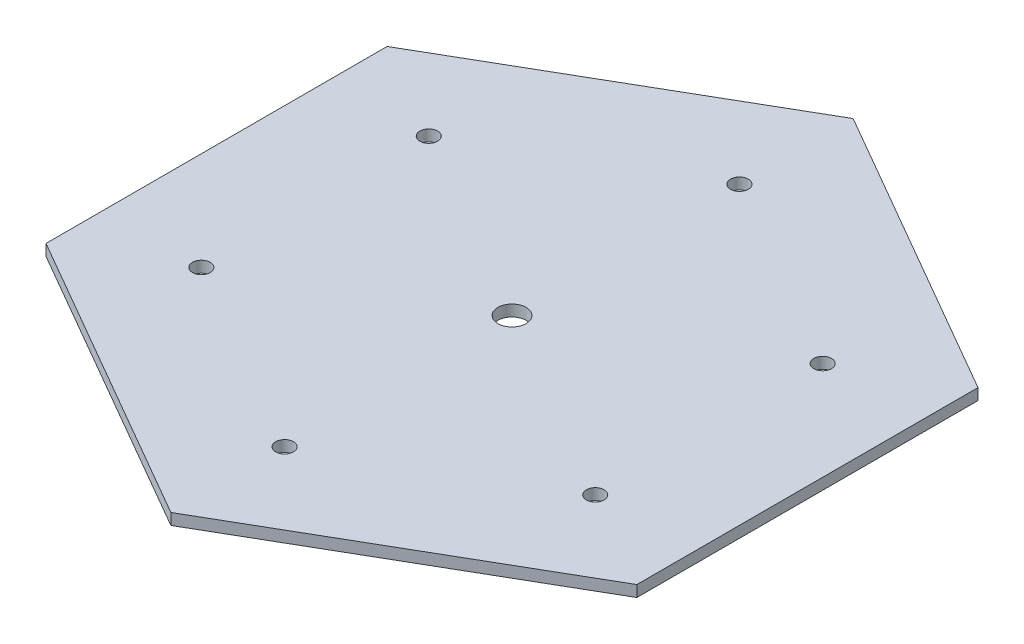
ISO-10303-21;
HEADER;
FILE_DESCRIPTION(('STEP AP214'),'2;1');
FILE_NAME('part.step','',(''),(''),'','','');
FILE_SCHEMA(('AUTOMOTIVE_DESIGN { 1 0 10303 214 1 1 1 1 }'));
ENDSEC;
DATA;
#1=APPLICATION_CONTEXT('core data for automotive mechanical design processes');
#2=APPLICATION_PROTOCOL_DEFINITION('international standard','automotive_design',2000,#1);
#3=PRODUCT_CONTEXT('',#1,'mechanical');
#4=PRODUCT('Part','Part','',(#3));
#5=PRODUCT_RELATED_PRODUCT_CATEGORY('part','',(#4));
#6=PRODUCT_DEFINITION_FORMATION('','',#4);
#7=PRODUCT_DEFINITION_CONTEXT('part definition',#1,'design');
#8=PRODUCT_DEFINITION('design','',#6,#7);
#9=PRODUCT_DEFINITION_SHAPE('','',#8);
#10=(LENGTH_UNIT() NAMED_UNIT(*) SI_UNIT(.MILLI.,.METRE.));
#11=(NAMED_UNIT(*) PLANE_ANGLE_UNIT() SI_UNIT($,.RADIAN.));
#12=(NAMED_UNIT(*) SI_UNIT($,.STERADIAN.) SOLID_ANGLE_UNIT());
#13=UNCERTAINTY_MEASURE_WITH_UNIT(LENGTH_MEASURE(1.E-05),#10,'distance_accuracy_value','');
#14=(GEOMETRIC_REPRESENTATION_CONTEXT(3) GLOBAL_UNCERTAINTY_ASSIGNED_CONTEXT((#13)) GLOBAL_UNIT_ASSIGNED_CONTEXT((#10,
#11,#12)) REPRESENTATION_CONTEXT('',''));
#15=CARTESIAN_POINT('',(0.,0.,0.));
#16=DIRECTION('',(0.,0.,1.));
#17=DIRECTION('',(1.,0.,0.));
#18=AXIS2_PLACEMENT_3D('',#15,#16,#17);
#19=CARTESIAN_POINT('',(41.656,3.175,-72.1503084400892));
#20=DIRECTION('',(-0.5,0.,0.866025403784439));
#21=DIRECTION('',(0.866025403784439,0.,0.5));
#22=AXIS2_PLACEMENT_3D('',#19,#20,#21);
#23=PLANE('',#22);
#24=DIRECTION('',(-0.866025403784439,0.,-0.5));
#25=VECTOR('',#24,1.);
#26=CARTESIAN_POINT('',(41.656,0.,-72.1503084400892));
#27=LINE('',#26,#25);
#28=CARTESIAN_POINT('',(83.312,0.,-48.1002056267261));
#29=VERTEX_POINT('',#28);
#30=CARTESIAN_POINT('',(0.,0.,-96.2004112534522));
#31=VERTEX_POINT('',#30);
#32=EDGE_CURVE('E141',#29,#31,#27,.T.);
#33=ORIENTED_EDGE('',*,*,#32,.T.);
#34=DIRECTION('',(0.,-1.,0.));
#35=VECTOR('',#34,1.);
#36=CARTESIAN_POINT('',(0.,3.175,-96.2004112534522));
#37=LINE('',#36,#35);
#38=CARTESIAN_POINT('',(0.,3.175,-96.2004112534522));
#39=VERTEX_POINT('',#38);
#40=EDGE_CURVE('E11',#39,#31,#37,.T.);
#41=ORIENTED_EDGE('',*,*,#40,.F.);
#42=DIRECTION('',(-0.866025403784439,0.,-0.5));
#43=VECTOR('',#42,1.);
#44=CARTESIAN_POINT('',(41.656,3.175,-72.1503084400892));
#45=LINE('',#44,#43);
#46=CARTESIAN_POINT('',(83.312,3.175,-48.1002056267261));
#47=VERTEX_POINT('',#46);
#48=EDGE_CURVE('E164',#47,#39,#45,.T.);
#49=ORIENTED_EDGE('',*,*,#48,.F.);
#50=DIRECTION('',(0.,-1.,0.));
#51=VECTOR('',#50,1.);
#52=CARTESIAN_POINT('',(83.312,3.175,-48.1002056267261));
#53=LINE('',#52,#51);
#54=EDGE_CURVE('E116',#47,#29,#53,.T.);
#55=ORIENTED_EDGE('',*,*,#54,.T.);
#56=EDGE_LOOP('',(#33,#41,#49,#55));
#57=FACE_BOUND('',#56,.T.);
#58=ADVANCED_FACE('F35',(#57),#23,.F.);
#59=CARTESIAN_POINT('',(-41.656,3.175,-72.1503084400892));
#60=DIRECTION('',(0.5,0.,0.866025403784439));
#61=DIRECTION('',(0.866025403784439,0.,-0.5));
#62=AXIS2_PLACEMENT_3D('',#59,#60,#61);
#63=PLANE('',#62);
#64=DIRECTION('',(-0.866025403784439,0.,0.5));
#65=VECTOR('',#64,1.);
#66=CARTESIAN_POINT('',(-41.656,0.,-72.1503084400892));
#67=LINE('',#66,#65);
#68=CARTESIAN_POINT('',(-83.312,0.,-48.1002056267261));
#69=VERTEX_POINT('',#68);
#70=EDGE_CURVE('E144',#31,#69,#67,.T.);
#71=ORIENTED_EDGE('',*,*,#70,.T.);
#72=DIRECTION('',(0.,-1.,0.));
#73=VECTOR('',#72,1.);
#74=CARTESIAN_POINT('',(-83.312,3.175,-48.1002056267261));
#75=LINE('',#74,#73);
#76=CARTESIAN_POINT('',(-83.312,3.175,-48.1002056267261));
#77=VERTEX_POINT('',#76);
#78=EDGE_CURVE('E44',#77,#69,#75,.T.);
#79=ORIENTED_EDGE('',*,*,#78,.F.);
#80=DIRECTION('',(-0.866025403784439,0.,0.5));
#81=VECTOR('',#80,1.);
#82=CARTESIAN_POINT('',(-41.656,3.175,-72.1503084400892));
#83=LINE('',#82,#81);
#84=EDGE_CURVE('E89',#39,#77,#83,.T.);
#85=ORIENTED_EDGE('',*,*,#84,.F.);
#86=ORIENTED_EDGE('',*,*,#40,.T.);
#87=EDGE_LOOP('',(#71,#79,#85,#86));
#88=FACE_BOUND('',#87,.T.);
#89=ADVANCED_FACE('F179',(#88),#63,.F.);
#90=CARTESIAN_POINT('',(-83.312,3.175,0.));
#91=DIRECTION('',(1.,0.,0.));
#92=DIRECTION('',(0.,0.,-1.));
#93=AXIS2_PLACEMENT_3D('',#90,#91,#92);
#94=PLANE('',#93);
#95=DIRECTION('',(0.,0.,1.));
#96=VECTOR('',#95,1.);
#97=CARTESIAN_POINT('',(-83.312,0.,0.));
#98=LINE('',#97,#96);
#99=CARTESIAN_POINT('',(-83.312,0.,48.1002056267261));
#100=VERTEX_POINT('',#99);
#101=EDGE_CURVE('E146',#69,#100,#98,.T.);
#102=ORIENTED_EDGE('',*,*,#101,.T.);
#103=DIRECTION('',(0.,-1.,0.));
#104=VECTOR('',#103,1.);
#105=CARTESIAN_POINT('',(-83.312,3.175,48.1002056267261));
#106=LINE('',#105,#104);
#107=CARTESIAN_POINT('',(-83.312,3.175,48.1002056267261));
#108=VERTEX_POINT('',#107);
#109=EDGE_CURVE('E111',#108,#100,#106,.T.);
#110=ORIENTED_EDGE('',*,*,#109,.F.);
#111=DIRECTION('',(0.,0.,1.));
#112=VECTOR('',#111,1.);
#113=CARTESIAN_POINT('',(-83.312,3.175,0.));
#114=LINE('',#113,#112);
#115=EDGE_CURVE('E102',#77,#108,#114,.T.);
#116=ORIENTED_EDGE('',*,*,#115,.F.);
#117=ORIENTED_EDGE('',*,*,#78,.T.);
#118=EDGE_LOOP('',(#102,#110,#116,#117));
#119=FACE_BOUND('',#118,.T.);
#120=ADVANCED_FACE('F157',(#119),#94,.F.);
#121=CARTESIAN_POINT('',(-41.656,3.175,72.1503084400892));
#122=DIRECTION('',(0.5,0.,-0.866025403784439));
#123=DIRECTION('',(-0.866025403784439,0.,-0.5));
#124=AXIS2_PLACEMENT_3D('',#121,#122,#123);
#125=PLANE('',#124);
#126=DIRECTION('',(0.866025403784439,0.,0.5));
#127=VECTOR('',#126,1.);
#128=CARTESIAN_POINT('',(-41.656,0.,72.1503084400892));
#129=LINE('',#128,#127);
#130=CARTESIAN_POINT('',(0.,0.,96.2004112534522));
#131=VERTEX_POINT('',#130);
#132=EDGE_CURVE('E110',#100,#131,#129,.T.);
#133=ORIENTED_EDGE('',*,*,#132,.T.);
#134=DIRECTION('',(0.,-1.,0.));
#135=VECTOR('',#134,1.);
#136=CARTESIAN_POINT('',(0.,3.175,96.2004112534522));
#137=LINE('',#136,#135);
#138=CARTESIAN_POINT('',(0.,3.175,96.2004112534522));
#139=VERTEX_POINT('',#138);
#140=EDGE_CURVE('E107',#139,#131,#137,.T.);
#141=ORIENTED_EDGE('',*,*,#140,.F.);
#142=DIRECTION('',(0.866025403784439,0.,0.5));
#143=VECTOR('',#142,1.);
#144=CARTESIAN_POINT('',(-41.656,3.175,72.1503084400892));
#145=LINE('',#144,#143);
#146=EDGE_CURVE('E96',#108,#139,#145,.T.);
#147=ORIENTED_EDGE('',*,*,#146,.F.);
#148=ORIENTED_EDGE('',*,*,#109,.T.);
#149=EDGE_LOOP('',(#133,#141,#147,#148));
#150=FACE_BOUND('',#149,.T.);
#151=ADVANCED_FACE('F108',(#150),#125,.F.);
#152=CARTESIAN_POINT('',(41.656,3.175,72.1503084400892));
#153=DIRECTION('',(-0.5,0.,-0.866025403784439));
#154=DIRECTION('',(-0.866025403784439,0.,0.5));
#155=AXIS2_PLACEMENT_3D('',#152,#153,#154);
#156=PLANE('',#155);
#157=DIRECTION('',(0.866025403784439,0.,-0.5));
#158=VECTOR('',#157,1.);
#159=CARTESIAN_POINT('',(41.656,0.,72.1503084400892));
#160=LINE('',#159,#158);
#161=CARTESIAN_POINT('',(83.3120000000001,0.,48.1002056267261));
#162=VERTEX_POINT('',#161);
#163=EDGE_CURVE('E75',#131,#162,#160,.T.);
#164=ORIENTED_EDGE('',*,*,#163,.T.);
#165=DIRECTION('',(0.,-1.,0.));
#166=VECTOR('',#165,1.);
#167=CARTESIAN_POINT('',(83.3120000000001,3.175,48.1002056267261));
#168=LINE('',#167,#166);
#169=CARTESIAN_POINT('',(83.3120000000001,3.175,48.1002056267261));
#170=VERTEX_POINT('',#169);
#171=EDGE_CURVE('E112',#170,#162,#168,.T.);
#172=ORIENTED_EDGE('',*,*,#171,.F.);
#173=DIRECTION('',(0.866025403784439,0.,-0.5));
#174=VECTOR('',#173,1.);
#175=CARTESIAN_POINT('',(41.656,3.175,72.1503084400892));
#176=LINE('',#175,#174);
#177=EDGE_CURVE('E100',#139,#170,#176,.T.);
#178=ORIENTED_EDGE('',*,*,#177,.F.);
#179=ORIENTED_EDGE('',*,*,#140,.T.);
#180=EDGE_LOOP('',(#164,#172,#178,#179));
#181=FACE_BOUND('',#180,.T.);
#182=ADVANCED_FACE('F114',(#181),#156,.F.);
#183=CARTESIAN_POINT('',(-55.541333303153,3.175,-32.0668037337261));
#184=DIRECTION('',(0.,-1.,0.));
#185=DIRECTION('',(0.,0.,-1.));
#186=AXIS2_PLACEMENT_3D('',#183,#184,#185);
#187=CYLINDRICAL_SURFACE('',#186,2.5);
#188=CARTESIAN_POINT('',(-55.541333303153,3.175,-32.0668037337261));
#189=DIRECTION('',(0.,1.,0.));
#190=DIRECTION('',(0.,0.,1.));
#191=AXIS2_PLACEMENT_3D('',#188,#189,#190);
#192=CIRCLE('',#191,2.5);
#193=CARTESIAN_POINT('',(-55.541333303153,3.175,-29.5668037337261));
#194=VERTEX_POINT('',#193);
#195=EDGE_CURVE('E340',#194,#194,#192,.T.);
#196=ORIENTED_EDGE('',*,*,#195,.T.);
#197=EDGE_LOOP('',(#196));
#198=FACE_BOUND('',#197,.T.);
#199=CARTESIAN_POINT('',(-55.541333303153,0.,-32.0668037337261));
#200=DIRECTION('',(0.,1.,0.));
#201=DIRECTION('',(0.,0.,1.));
#202=AXIS2_PLACEMENT_3D('',#199,#200,#201);
#203=CIRCLE('',#202,2.5);
#204=CARTESIAN_POINT('',(-55.541333303153,0.,-29.5668037337261));
#205=VERTEX_POINT('',#204);
#206=EDGE_CURVE('E138',#205,#205,#203,.T.);
#207=ORIENTED_EDGE('',*,*,#206,.F.);
#208=EDGE_LOOP('',(#207));
#209=FACE_BOUND('',#208,.T.);
#210=ADVANCED_FACE('F187',(#198,#209),#187,.F.);
#211=CARTESIAN_POINT('',(0.,3.175,-64.1336074674522));
#212=DIRECTION('',(0.,-1.,0.));
#213=DIRECTION('',(0.,0.,-1.));
#214=AXIS2_PLACEMENT_3D('',#211,#212,#213);
#215=CYLINDRICAL_SURFACE('',#214,2.5);
#216=CARTESIAN_POINT('',(0.,3.175,-64.1336074674522));
#217=DIRECTION('',(0.,1.,0.));
#218=DIRECTION('',(0.,0.,1.));
#219=AXIS2_PLACEMENT_3D('',#216,#217,#218);
#220=CIRCLE('',#219,2.5);
#221=CARTESIAN_POINT('',(0.,3.175,-61.6336074674522));
#222=VERTEX_POINT('',#221);
#223=EDGE_CURVE('E337',#222,#222,#220,.T.);
#224=ORIENTED_EDGE('',*,*,#223,.T.);
#225=EDGE_LOOP('',(#224));
#226=FACE_BOUND('',#225,.T.);
#227=CARTESIAN_POINT('',(0.,0.,-64.1336074674522));
#228=DIRECTION('',(0.,1.,0.));
#229=DIRECTION('',(0.,0.,1.));
#230=AXIS2_PLACEMENT_3D('',#227,#228,#229);
#231=CIRCLE('',#230,2.5);
#232=CARTESIAN_POINT('',(0.,0.,-61.6336074674522));
#233=VERTEX_POINT('',#232);
#234=EDGE_CURVE('E135',#233,#233,#231,.T.);
#235=ORIENTED_EDGE('',*,*,#234,.F.);
#236=EDGE_LOOP('',(#235));
#237=FACE_BOUND('',#236,.T.);
#238=ADVANCED_FACE('F190',(#226,#237),#215,.F.);
#239=CARTESIAN_POINT('',(55.541333303153,3.175,-32.0668037337261));
#240=DIRECTION('',(0.,-1.,0.));
#241=DIRECTION('',(0.,0.,-1.));
#242=AXIS2_PLACEMENT_3D('',#239,#240,#241);
#243=CYLINDRICAL_SURFACE('',#242,2.5);
#244=CARTESIAN_POINT('',(55.541333303153,3.175,-32.0668037337261));
#245=DIRECTION('',(0.,1.,0.));
#246=DIRECTION('',(0.,0.,1.));
#247=AXIS2_PLACEMENT_3D('',#244,#245,#246);
#248=CIRCLE('',#247,2.5);
#249=CARTESIAN_POINT('',(55.541333303153,3.175,-29.5668037337261));
#250=VERTEX_POINT('',#249);
#251=EDGE_CURVE('E334',#250,#250,#248,.T.);
#252=ORIENTED_EDGE('',*,*,#251,.T.);
#253=EDGE_LOOP('',(#252));
#254=FACE_BOUND('',#253,.T.);
#255=CARTESIAN_POINT('',(55.541333303153,0.,-32.0668037337261));
#256=DIRECTION('',(0.,1.,0.));
#257=DIRECTION('',(0.,0.,1.));
#258=AXIS2_PLACEMENT_3D('',#255,#256,#257);
#259=CIRCLE('',#258,2.5);
#260=CARTESIAN_POINT('',(55.541333303153,0.,-29.5668037337261));
#261=VERTEX_POINT('',#260);
#262=EDGE_CURVE('E132',#261,#261,#259,.T.);
#263=ORIENTED_EDGE('',*,*,#262,.F.);
#264=EDGE_LOOP('',(#263));
#265=FACE_BOUND('',#264,.T.);
#266=ADVANCED_FACE('F194',(#254,#265),#243,.F.);
#267=CARTESIAN_POINT('',(55.541333303153,3.175,32.0668037337261));
#268=DIRECTION('',(0.,-1.,0.));
#269=DIRECTION('',(0.,0.,-1.));
#270=AXIS2_PLACEMENT_3D('',#267,#268,#269);
#271=CYLINDRICAL_SURFACE('',#270,2.5);
#272=CARTESIAN_POINT('',(55.541333303153,3.175,32.0668037337261));
#273=DIRECTION('',(0.,1.,0.));
#274=DIRECTION('',(0.,0.,1.));
#275=AXIS2_PLACEMENT_3D('',#272,#273,#274);
#276=CIRCLE('',#275,2.5);
#277=CARTESIAN_POINT('',(55.541333303153,3.175,34.5668037337261));
#278=VERTEX_POINT('',#277);
#279=EDGE_CURVE('E327',#278,#278,#276,.T.);
#280=ORIENTED_EDGE('',*,*,#279,.T.);
#281=EDGE_LOOP('',(#280));
#282=FACE_BOUND('',#281,.T.);
#283=CARTESIAN_POINT('',(55.541333303153,0.,32.0668037337261));
#284=DIRECTION('',(0.,1.,0.));
#285=DIRECTION('',(0.,0.,1.));
#286=AXIS2_PLACEMENT_3D('',#283,#284,#285);
#287=CIRCLE('',#286,2.5);
#288=CARTESIAN_POINT('',(55.541333303153,0.,34.5668037337261));
#289=VERTEX_POINT('',#288);
#290=EDGE_CURVE('E129',#289,#289,#287,.T.);
#291=ORIENTED_EDGE('',*,*,#290,.F.);
#292=EDGE_LOOP('',(#291));
#293=FACE_BOUND('',#292,.T.);
#294=ADVANCED_FACE('F198',(#282,#293),#271,.F.);
#295=CARTESIAN_POINT('',(0.,3.175,64.1336074674522));
#296=DIRECTION('',(0.,-1.,0.));
#297=DIRECTION('',(0.,0.,-1.));
#298=AXIS2_PLACEMENT_3D('',#295,#296,#297);
#299=CYLINDRICAL_SURFACE('',#298,2.5);
#300=CARTESIAN_POINT('',(0.,3.175,64.1336074674522));
#301=DIRECTION('',(0.,1.,0.));
#302=DIRECTION('',(0.,0.,1.));
#303=AXIS2_PLACEMENT_3D('',#300,#301,#302);
#304=CIRCLE('',#303,2.5);
#305=CARTESIAN_POINT('',(0.,3.175,66.6336074674522));
#306=VERTEX_POINT('',#305);
#307=EDGE_CURVE('E324',#306,#306,#304,.T.);
#308=ORIENTED_EDGE('',*,*,#307,.T.);
#309=EDGE_LOOP('',(#308));
#310=FACE_BOUND('',#309,.T.);
#311=CARTESIAN_POINT('',(0.,0.,64.1336074674522));
#312=DIRECTION('',(0.,1.,0.));
#313=DIRECTION('',(0.,0.,1.));
#314=AXIS2_PLACEMENT_3D('',#311,#312,#313);
#315=CIRCLE('',#314,2.5);
#316=CARTESIAN_POINT('',(0.,0.,66.6336074674522));
#317=VERTEX_POINT('',#316);
#318=EDGE_CURVE('E126',#317,#317,#315,.T.);
#319=ORIENTED_EDGE('',*,*,#318,.F.);
#320=EDGE_LOOP('',(#319));
#321=FACE_BOUND('',#320,.T.);
#322=ADVANCED_FACE('F202',(#310,#321),#299,.F.);
#323=CARTESIAN_POINT('',(-55.541333303153,3.175,32.0668037337261));
#324=DIRECTION('',(0.,-1.,0.));
#325=DIRECTION('',(0.,0.,-1.));
#326=AXIS2_PLACEMENT_3D('',#323,#324,#325);
#327=CYLINDRICAL_SURFACE('',#326,2.5);
#328=CARTESIAN_POINT('',(-55.541333303153,3.175,32.0668037337261));
#329=DIRECTION('',(0.,1.,0.));
#330=DIRECTION('',(0.,0.,1.));
#331=AXIS2_PLACEMENT_3D('',#328,#329,#330);
#332=CIRCLE('',#331,2.5);
#333=CARTESIAN_POINT('',(-55.541333303153,3.175,34.5668037337261));
#334=VERTEX_POINT('',#333);
#335=EDGE_CURVE('E213',#334,#334,#332,.T.);
#336=ORIENTED_EDGE('',*,*,#335,.T.);
#337=EDGE_LOOP('',(#336));
#338=FACE_BOUND('',#337,.T.);
#339=CARTESIAN_POINT('',(-55.541333303153,0.,32.0668037337261));
#340=DIRECTION('',(0.,1.,0.));
#341=DIRECTION('',(0.,0.,1.));
#342=AXIS2_PLACEMENT_3D('',#339,#340,#341);
#343=CIRCLE('',#342,2.5);
#344=CARTESIAN_POINT('',(-55.541333303153,0.,34.5668037337261));
#345=VERTEX_POINT('',#344);
#346=EDGE_CURVE('E123',#345,#345,#343,.T.);
#347=ORIENTED_EDGE('',*,*,#346,.F.);
#348=EDGE_LOOP('',(#347));
#349=FACE_BOUND('',#348,.T.);
#350=ADVANCED_FACE('F174',(#338,#349),#327,.F.);
#351=CARTESIAN_POINT('',(0.,3.175,0.));
#352=DIRECTION('',(0.,-1.,0.));
#353=DIRECTION('',(0.,0.,-1.));
#354=AXIS2_PLACEMENT_3D('',#351,#352,#353);
#355=CYLINDRICAL_SURFACE('',#354,3.96875);
#356=CARTESIAN_POINT('',(0.,3.175,0.));
#357=DIRECTION('',(0.,1.,0.));
#358=DIRECTION('',(0.,0.,1.));
#359=AXIS2_PLACEMENT_3D('',#356,#357,#358);
#360=CIRCLE('',#359,3.96875);
#361=CARTESIAN_POINT('',(0.,3.175,3.96875));
#362=VERTEX_POINT('',#361);
#363=EDGE_CURVE('E151',#362,#362,#360,.T.);
#364=ORIENTED_EDGE('',*,*,#363,.T.);
#365=EDGE_LOOP('',(#364));
#366=FACE_BOUND('',#365,.T.);
#367=CARTESIAN_POINT('',(0.,0.,0.));
#368=DIRECTION('',(0.,1.,0.));
#369=DIRECTION('',(0.,0.,1.));
#370=AXIS2_PLACEMENT_3D('',#367,#368,#369);
#371=CIRCLE('',#370,3.96875);
#372=CARTESIAN_POINT('',(0.,0.,3.96875));
#373=VERTEX_POINT('',#372);
#374=EDGE_CURVE('E120',#373,#373,#371,.T.);
#375=ORIENTED_EDGE('',*,*,#374,.F.);
#376=EDGE_LOOP('',(#375));
#377=FACE_BOUND('',#376,.T.);
#378=ADVANCED_FACE('F37',(#366,#377),#355,.F.);
#379=CARTESIAN_POINT('',(83.312,3.175,0.));
#380=DIRECTION('',(-1.,0.,0.));
#381=DIRECTION('',(0.,0.,1.));
#382=AXIS2_PLACEMENT_3D('',#379,#380,#381);
#383=PLANE('',#382);
#384=DIRECTION('',(0.,0.,-1.));
#385=VECTOR('',#384,1.);
#386=CARTESIAN_POINT('',(83.312,0.,0.));
#387=LINE('',#386,#385);
#388=EDGE_CURVE('E81',#162,#29,#387,.T.);
#389=ORIENTED_EDGE('',*,*,#388,.T.);
#390=ORIENTED_EDGE('',*,*,#54,.F.);
#391=DIRECTION('',(0.,0.,-1.));
#392=VECTOR('',#391,1.);
#393=CARTESIAN_POINT('',(83.312,3.175,0.));
#394=LINE('',#393,#392);
#395=EDGE_CURVE('E52',#170,#47,#394,.T.);
#396=ORIENTED_EDGE('',*,*,#395,.F.);
#397=ORIENTED_EDGE('',*,*,#171,.T.);
#398=EDGE_LOOP('',(#389,#390,#396,#397));
#399=FACE_BOUND('',#398,.T.);
#400=ADVANCED_FACE('F165',(#399),#383,.F.);
#401=CARTESIAN_POINT('',(0.,3.175,0.));
#402=DIRECTION('',(0.,1.,0.));
#403=DIRECTION('',(0.,0.,1.));
#404=AXIS2_PLACEMENT_3D('',#401,#402,#403);
#405=PLANE('',#404);
#406=ORIENTED_EDGE('',*,*,#363,.F.);
#407=EDGE_LOOP('',(#406));
#408=FACE_BOUND('',#407,.T.);
#409=ORIENTED_EDGE('',*,*,#335,.F.);
#410=EDGE_LOOP('',(#409));
#411=FACE_BOUND('',#410,.T.);
#412=ORIENTED_EDGE('',*,*,#307,.F.);
#413=EDGE_LOOP('',(#412));
#414=FACE_BOUND('',#413,.T.);
#415=ORIENTED_EDGE('',*,*,#279,.F.);
#416=EDGE_LOOP('',(#415));
#417=FACE_BOUND('',#416,.T.);
#418=ORIENTED_EDGE('',*,*,#251,.F.);
#419=EDGE_LOOP('',(#418));
#420=FACE_BOUND('',#419,.T.);
#421=ORIENTED_EDGE('',*,*,#223,.F.);
#422=EDGE_LOOP('',(#421));
#423=FACE_BOUND('',#422,.T.);
#424=ORIENTED_EDGE('',*,*,#195,.F.);
#425=EDGE_LOOP('',(#424));
#426=FACE_BOUND('',#425,.T.);
#427=ORIENTED_EDGE('',*,*,#48,.T.);
#428=ORIENTED_EDGE('',*,*,#84,.T.);
#429=ORIENTED_EDGE('',*,*,#115,.T.);
#430=ORIENTED_EDGE('',*,*,#146,.T.);
#431=ORIENTED_EDGE('',*,*,#177,.T.);
#432=ORIENTED_EDGE('',*,*,#395,.T.);
#433=EDGE_LOOP('',(#427,#428,#429,#430,#431,#432));
#434=FACE_BOUND('',#433,.T.);
#435=ADVANCED_FACE('F98',(#408,#411,#414,#417,#420,#423,#426,#434),#405,.T.);
#436=CARTESIAN_POINT('',(0.,0.,0.));
#437=DIRECTION('',(0.,1.,0.));
#438=DIRECTION('',(0.,0.,1.));
#439=AXIS2_PLACEMENT_3D('',#436,#437,#438);
#440=PLANE('',#439);
#441=ORIENTED_EDGE('',*,*,#374,.T.);
#442=EDGE_LOOP('',(#441));
#443=FACE_BOUND('',#442,.T.);
#444=ORIENTED_EDGE('',*,*,#346,.T.);
#445=EDGE_LOOP('',(#444));
#446=FACE_BOUND('',#445,.T.);
#447=ORIENTED_EDGE('',*,*,#318,.T.);
#448=EDGE_LOOP('',(#447));
#449=FACE_BOUND('',#448,.T.);
#450=ORIENTED_EDGE('',*,*,#290,.T.);
#451=EDGE_LOOP('',(#450));
#452=FACE_BOUND('',#451,.T.);
#453=ORIENTED_EDGE('',*,*,#262,.T.);
#454=EDGE_LOOP('',(#453));
#455=FACE_BOUND('',#454,.T.);
#456=ORIENTED_EDGE('',*,*,#234,.T.);
#457=EDGE_LOOP('',(#456));
#458=FACE_BOUND('',#457,.T.);
#459=ORIENTED_EDGE('',*,*,#206,.T.);
#460=EDGE_LOOP('',(#459));
#461=FACE_BOUND('',#460,.T.);
#462=ORIENTED_EDGE('',*,*,#32,.F.);
#463=ORIENTED_EDGE('',*,*,#388,.F.);
#464=ORIENTED_EDGE('',*,*,#163,.F.);
#465=ORIENTED_EDGE('',*,*,#132,.F.);
#466=ORIENTED_EDGE('',*,*,#101,.F.);
#467=ORIENTED_EDGE('',*,*,#70,.F.);
#468=EDGE_LOOP('',(#462,#463,#464,#465,#466,#467));
#469=FACE_BOUND('',#468,.T.);
#470=ADVANCED_FACE('F160',(#443,#446,#449,#452,#455,#458,#461,#469),#440,.F.);
#471=CLOSED_SHELL('',(#58,#89,#120,#151,#182,#210,#238,#266,#294,#322,#350,#378,#400,#435,#470));
#472=MANIFOLD_SOLID_BREP('B2',#471);
#473=ADVANCED_BREP_SHAPE_REPRESENTATION('',(#18,#472),#14);
#474=SHAPE_DEFINITION_REPRESENTATION(#9,#473);
ENDSEC;
END-ISO-10303-21;
